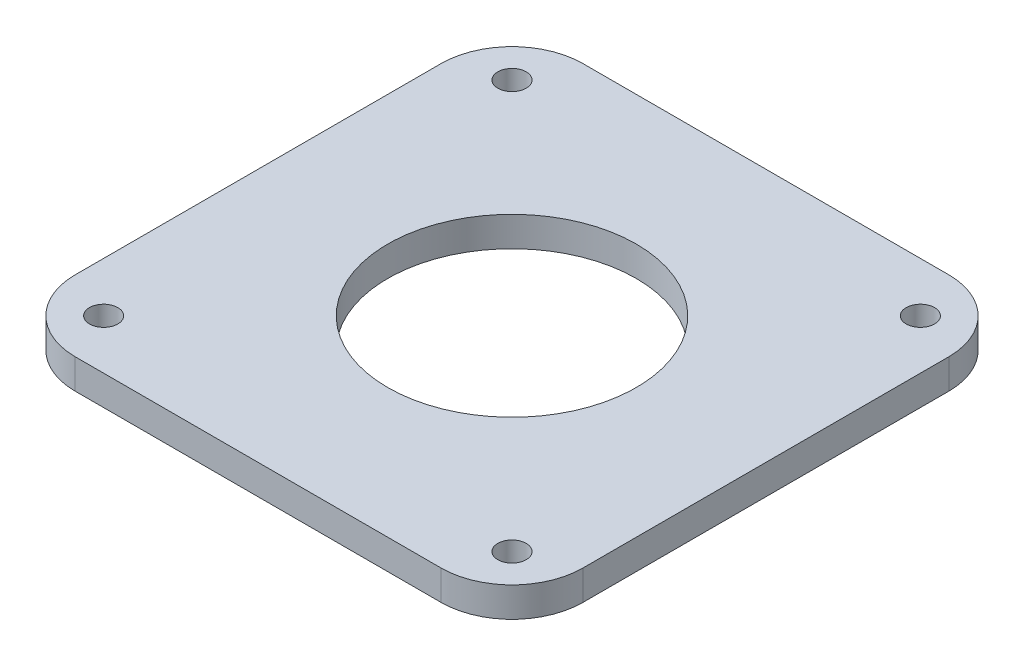
ISO-10303-21;
HEADER;
FILE_DESCRIPTION(('STEP AP214'),'2;1');
FILE_NAME('part.step','',(''),(''),'','','');
FILE_SCHEMA(('AUTOMOTIVE_DESIGN { 1 0 10303 214 1 1 1 1 }'));
ENDSEC;
DATA;
#1=APPLICATION_CONTEXT('core data for automotive mechanical design processes');
#2=APPLICATION_PROTOCOL_DEFINITION('international standard','automotive_design',2000,#1);
#3=PRODUCT_CONTEXT('',#1,'mechanical');
#4=PRODUCT('Part','Part','',(#3));
#5=PRODUCT_RELATED_PRODUCT_CATEGORY('part','',(#4));
#6=PRODUCT_DEFINITION_FORMATION('','',#4);
#7=PRODUCT_DEFINITION_CONTEXT('part definition',#1,'design');
#8=PRODUCT_DEFINITION('design','',#6,#7);
#9=PRODUCT_DEFINITION_SHAPE('','',#8);
#10=(LENGTH_UNIT() NAMED_UNIT(*) SI_UNIT(.MILLI.,.METRE.));
#11=(NAMED_UNIT(*) PLANE_ANGLE_UNIT() SI_UNIT($,.RADIAN.));
#12=(NAMED_UNIT(*) SI_UNIT($,.STERADIAN.) SOLID_ANGLE_UNIT());
#13=UNCERTAINTY_MEASURE_WITH_UNIT(LENGTH_MEASURE(1.E-05),#10,'distance_accuracy_value','');
#14=(GEOMETRIC_REPRESENTATION_CONTEXT(3) GLOBAL_UNCERTAINTY_ASSIGNED_CONTEXT((#13)) GLOBAL_UNIT_ASSIGNED_CONTEXT((#10,
#11,#12)) REPRESENTATION_CONTEXT('',''));
#15=CARTESIAN_POINT('',(0.,0.,0.));
#16=DIRECTION('',(0.,0.,1.));
#17=DIRECTION('',(1.,0.,0.));
#18=AXIS2_PLACEMENT_3D('',#15,#16,#17);
#19=CARTESIAN_POINT('',(35.75,4.2,-35.75));
#20=DIRECTION('',(-1.,0.,0.));
#21=DIRECTION('',(0.,0.,1.));
#22=AXIS2_PLACEMENT_3D('',#19,#20,#21);
#23=PLANE('',#22);
#24=DIRECTION('',(0.,0.,-1.));
#25=VECTOR('',#24,1.);
#26=CARTESIAN_POINT('',(35.75,0.,-35.75));
#27=LINE('',#26,#25);
#28=CARTESIAN_POINT('',(35.75,0.,25.75));
#29=VERTEX_POINT('',#28);
#30=CARTESIAN_POINT('',(35.75,0.,-25.75));
#31=VERTEX_POINT('',#30);
#32=EDGE_CURVE('E141',#29,#31,#27,.T.);
#33=ORIENTED_EDGE('',*,*,#32,.T.);
#34=DIRECTION('',(0.,-1.,0.));
#35=VECTOR('',#34,1.);
#36=CARTESIAN_POINT('',(35.75,4.2,-25.75));
#37=LINE('',#36,#35);
#38=CARTESIAN_POINT('',(35.75,4.2,-25.75));
#39=VERTEX_POINT('',#38);
#40=EDGE_CURVE('E116',#31,#39,#37,.F.);
#41=ORIENTED_EDGE('',*,*,#40,.T.);
#42=DIRECTION('',(0.,0.,-1.));
#43=VECTOR('',#42,1.);
#44=CARTESIAN_POINT('',(35.75,4.2,-35.75));
#45=LINE('',#44,#43);
#46=CARTESIAN_POINT('',(35.75,4.2,25.75));
#47=VERTEX_POINT('',#46);
#48=EDGE_CURVE('E154',#47,#39,#45,.T.);
#49=ORIENTED_EDGE('',*,*,#48,.F.);
#50=DIRECTION('',(0.,-1.,0.));
#51=VECTOR('',#50,1.);
#52=CARTESIAN_POINT('',(35.75,4.2,25.75));
#53=LINE('',#52,#51);
#54=EDGE_CURVE('E122',#47,#29,#53,.T.);
#55=ORIENTED_EDGE('',*,*,#54,.T.);
#56=EDGE_LOOP('',(#33,#41,#49,#55));
#57=FACE_BOUND('',#56,.T.);
#58=ADVANCED_FACE('F44',(#57),#23,.F.);
#59=CARTESIAN_POINT('',(-35.75,4.2,-35.75));
#60=DIRECTION('',(0.,0.,1.));
#61=DIRECTION('',(1.,0.,0.));
#62=AXIS2_PLACEMENT_3D('',#59,#60,#61);
#63=PLANE('',#62);
#64=DIRECTION('',(-1.,0.,0.));
#65=VECTOR('',#64,1.);
#66=CARTESIAN_POINT('',(-35.75,4.2,-35.75));
#67=LINE('',#66,#65);
#68=CARTESIAN_POINT('',(25.75,4.2,-35.75));
#69=VERTEX_POINT('',#68);
#70=CARTESIAN_POINT('',(-25.75,4.2,-35.75));
#71=VERTEX_POINT('',#70);
#72=EDGE_CURVE('E132',#69,#71,#67,.T.);
#73=ORIENTED_EDGE('',*,*,#72,.F.);
#74=DIRECTION('',(0.,-1.,0.));
#75=VECTOR('',#74,1.);
#76=CARTESIAN_POINT('',(25.75,4.2,-35.75));
#77=LINE('',#76,#75);
#78=CARTESIAN_POINT('',(25.75,0.,-35.75));
#79=VERTEX_POINT('',#78);
#80=EDGE_CURVE('E115',#69,#79,#77,.T.);
#81=ORIENTED_EDGE('',*,*,#80,.T.);
#82=DIRECTION('',(-1.,0.,0.));
#83=VECTOR('',#82,1.);
#84=CARTESIAN_POINT('',(-35.75,0.,-35.75));
#85=LINE('',#84,#83);
#86=CARTESIAN_POINT('',(-25.75,0.,-35.75));
#87=VERTEX_POINT('',#86);
#88=EDGE_CURVE('E129',#79,#87,#85,.T.);
#89=ORIENTED_EDGE('',*,*,#88,.T.);
#90=DIRECTION('',(0.,-1.,0.));
#91=VECTOR('',#90,1.);
#92=CARTESIAN_POINT('',(-25.75,4.2,-35.75));
#93=LINE('',#92,#91);
#94=EDGE_CURVE('E135',#87,#71,#93,.F.);
#95=ORIENTED_EDGE('',*,*,#94,.T.);
#96=EDGE_LOOP('',(#73,#81,#89,#95));
#97=FACE_BOUND('',#96,.T.);
#98=ADVANCED_FACE('F128',(#97),#63,.F.);
#99=CARTESIAN_POINT('',(-35.75,4.2,-35.75));
#100=DIRECTION('',(1.,0.,0.));
#101=DIRECTION('',(0.,0.,-1.));
#102=AXIS2_PLACEMENT_3D('',#99,#100,#101);
#103=PLANE('',#102);
#104=DIRECTION('',(0.,0.,1.));
#105=VECTOR('',#104,1.);
#106=CARTESIAN_POINT('',(-35.75,4.2,-35.75));
#107=LINE('',#106,#105);
#108=CARTESIAN_POINT('',(-35.75,4.2,-25.75));
#109=VERTEX_POINT('',#108);
#110=CARTESIAN_POINT('',(-35.75,4.2,25.75));
#111=VERTEX_POINT('',#110);
#112=EDGE_CURVE('E190',#109,#111,#107,.T.);
#113=ORIENTED_EDGE('',*,*,#112,.F.);
#114=DIRECTION('',(0.,-1.,0.));
#115=VECTOR('',#114,1.);
#116=CARTESIAN_POINT('',(-35.75,4.2,-25.75));
#117=LINE('',#116,#115);
#118=CARTESIAN_POINT('',(-35.75,0.,-25.75));
#119=VERTEX_POINT('',#118);
#120=EDGE_CURVE('E184',#109,#119,#117,.T.);
#121=ORIENTED_EDGE('',*,*,#120,.T.);
#122=DIRECTION('',(0.,0.,1.));
#123=VECTOR('',#122,1.);
#124=CARTESIAN_POINT('',(-35.75,0.,-35.75));
#125=LINE('',#124,#123);
#126=CARTESIAN_POINT('',(-35.75,0.,25.75));
#127=VERTEX_POINT('',#126);
#128=EDGE_CURVE('E140',#119,#127,#125,.T.);
#129=ORIENTED_EDGE('',*,*,#128,.T.);
#130=DIRECTION('',(0.,-1.,0.));
#131=VECTOR('',#130,1.);
#132=CARTESIAN_POINT('',(-35.75,4.2,25.75));
#133=LINE('',#132,#131);
#134=EDGE_CURVE('E181',#127,#111,#133,.F.);
#135=ORIENTED_EDGE('',*,*,#134,.T.);
#136=EDGE_LOOP('',(#113,#121,#129,#135));
#137=FACE_BOUND('',#136,.T.);
#138=ADVANCED_FACE('F271',(#137),#103,.F.);
#139=CARTESIAN_POINT('',(-35.75,4.2,35.75));
#140=DIRECTION('',(0.,0.,-1.));
#141=DIRECTION('',(-1.,0.,0.));
#142=AXIS2_PLACEMENT_3D('',#139,#140,#141);
#143=PLANE('',#142);
#144=DIRECTION('',(1.,0.,0.));
#145=VECTOR('',#144,1.);
#146=CARTESIAN_POINT('',(-35.75,4.2,35.75));
#147=LINE('',#146,#145);
#148=CARTESIAN_POINT('',(-25.75,4.2,35.75));
#149=VERTEX_POINT('',#148);
#150=CARTESIAN_POINT('',(25.75,4.2,35.75));
#151=VERTEX_POINT('',#150);
#152=EDGE_CURVE('E156',#149,#151,#147,.T.);
#153=ORIENTED_EDGE('',*,*,#152,.F.);
#154=DIRECTION('',(0.,-1.,0.));
#155=VECTOR('',#154,1.);
#156=CARTESIAN_POINT('',(-25.75,4.2,35.75));
#157=LINE('',#156,#155);
#158=CARTESIAN_POINT('',(-25.75,0.,35.75));
#159=VERTEX_POINT('',#158);
#160=EDGE_CURVE('E11',#149,#159,#157,.T.);
#161=ORIENTED_EDGE('',*,*,#160,.T.);
#162=DIRECTION('',(1.,0.,0.));
#163=VECTOR('',#162,1.);
#164=CARTESIAN_POINT('',(-35.75,0.,35.75));
#165=LINE('',#164,#163);
#166=CARTESIAN_POINT('',(25.75,0.,35.75));
#167=VERTEX_POINT('',#166);
#168=EDGE_CURVE('E146',#159,#167,#165,.T.);
#169=ORIENTED_EDGE('',*,*,#168,.T.);
#170=DIRECTION('',(0.,-1.,0.));
#171=VECTOR('',#170,1.);
#172=CARTESIAN_POINT('',(25.75,4.2,35.75));
#173=LINE('',#172,#171);
#174=EDGE_CURVE('E53',#167,#151,#173,.F.);
#175=ORIENTED_EDGE('',*,*,#174,.T.);
#176=EDGE_LOOP('',(#153,#161,#169,#175));
#177=FACE_BOUND('',#176,.T.);
#178=ADVANCED_FACE('F244',(#177),#143,.F.);
#179=CARTESIAN_POINT('',(0.,4.2,0.));
#180=DIRECTION('',(0.,1.,0.));
#181=DIRECTION('',(0.,0.,1.));
#182=AXIS2_PLACEMENT_3D('',#179,#180,#181);
#183=PLANE('',#182);
#184=CARTESIAN_POINT('',(28.75,4.2,-28.75));
#185=DIRECTION('',(0.,1.,0.));
#186=DIRECTION('',(0.,0.,1.));
#187=AXIS2_PLACEMENT_3D('',#184,#185,#186);
#188=CIRCLE('',#187,2.);
#189=CARTESIAN_POINT('',(28.75,4.2,-26.75));
#190=VERTEX_POINT('',#189);
#191=EDGE_CURVE('E211',#190,#190,#188,.T.);
#192=ORIENTED_EDGE('',*,*,#191,.F.);
#193=EDGE_LOOP('',(#192));
#194=FACE_BOUND('',#193,.T.);
#195=CARTESIAN_POINT('',(-28.75,4.2,28.75));
#196=DIRECTION('',(0.,1.,0.));
#197=DIRECTION('',(0.,0.,1.));
#198=AXIS2_PLACEMENT_3D('',#195,#196,#197);
#199=CIRCLE('',#198,2.);
#200=CARTESIAN_POINT('',(-28.75,4.2,30.75));
#201=VERTEX_POINT('',#200);
#202=EDGE_CURVE('E219',#201,#201,#199,.T.);
#203=ORIENTED_EDGE('',*,*,#202,.F.);
#204=EDGE_LOOP('',(#203));
#205=FACE_BOUND('',#204,.T.);
#206=CARTESIAN_POINT('',(28.75,4.2,28.75));
#207=DIRECTION('',(0.,1.,0.));
#208=DIRECTION('',(0.,0.,1.));
#209=AXIS2_PLACEMENT_3D('',#206,#207,#208);
#210=CIRCLE('',#209,2.);
#211=CARTESIAN_POINT('',(28.75,4.2,30.75));
#212=VERTEX_POINT('',#211);
#213=EDGE_CURVE('E220',#212,#212,#210,.T.);
#214=ORIENTED_EDGE('',*,*,#213,.F.);
#215=EDGE_LOOP('',(#214));
#216=FACE_BOUND('',#215,.T.);
#217=CARTESIAN_POINT('',(-28.75,4.2,-28.75));
#218=DIRECTION('',(0.,1.,0.));
#219=DIRECTION('',(0.,0.,1.));
#220=AXIS2_PLACEMENT_3D('',#217,#218,#219);
#221=CIRCLE('',#220,2.);
#222=CARTESIAN_POINT('',(-28.75,4.2,-26.75));
#223=VERTEX_POINT('',#222);
#224=EDGE_CURVE('E207',#223,#223,#221,.T.);
#225=ORIENTED_EDGE('',*,*,#224,.F.);
#226=EDGE_LOOP('',(#225));
#227=FACE_BOUND('',#226,.T.);
#228=CARTESIAN_POINT('',(0.,4.2,0.));
#229=DIRECTION('',(0.,1.,0.));
#230=DIRECTION('',(0.,0.,1.));
#231=AXIS2_PLACEMENT_3D('',#228,#229,#230);
#232=CIRCLE('',#231,17.5);
#233=CARTESIAN_POINT('',(0.,4.2,17.5));
#234=VERTEX_POINT('',#233);
#235=EDGE_CURVE('E199',#234,#234,#232,.T.);
#236=ORIENTED_EDGE('',*,*,#235,.F.);
#237=EDGE_LOOP('',(#236));
#238=FACE_BOUND('',#237,.T.);
#239=ORIENTED_EDGE('',*,*,#48,.T.);
#240=CARTESIAN_POINT('',(25.75,4.2,-25.75));
#241=DIRECTION('',(0.,1.,0.));
#242=DIRECTION('',(0.,0.,1.));
#243=AXIS2_PLACEMENT_3D('',#240,#241,#242);
#244=CIRCLE('',#243,10.);
#245=EDGE_CURVE('E178',#39,#69,#244,.T.);
#246=ORIENTED_EDGE('',*,*,#245,.T.);
#247=ORIENTED_EDGE('',*,*,#72,.T.);
#248=CARTESIAN_POINT('',(-25.75,4.2,-25.75));
#249=DIRECTION('',(0.,1.,0.));
#250=DIRECTION('',(0.,0.,1.));
#251=AXIS2_PLACEMENT_3D('',#248,#249,#250);
#252=CIRCLE('',#251,10.);
#253=EDGE_CURVE('E175',#71,#109,#252,.T.);
#254=ORIENTED_EDGE('',*,*,#253,.T.);
#255=ORIENTED_EDGE('',*,*,#112,.T.);
#256=CARTESIAN_POINT('',(-25.75,4.2,25.75));
#257=DIRECTION('',(0.,1.,0.));
#258=DIRECTION('',(0.,0.,1.));
#259=AXIS2_PLACEMENT_3D('',#256,#257,#258);
#260=CIRCLE('',#259,10.);
#261=EDGE_CURVE('E66',#111,#149,#260,.T.);
#262=ORIENTED_EDGE('',*,*,#261,.T.);
#263=ORIENTED_EDGE('',*,*,#152,.T.);
#264=CARTESIAN_POINT('',(25.75,4.2,25.75));
#265=DIRECTION('',(0.,1.,0.));
#266=DIRECTION('',(0.,0.,1.));
#267=AXIS2_PLACEMENT_3D('',#264,#265,#266);
#268=CIRCLE('',#267,10.);
#269=EDGE_CURVE('E170',#151,#47,#268,.T.);
#270=ORIENTED_EDGE('',*,*,#269,.T.);
#271=EDGE_LOOP('',(#239,#246,#247,#254,#255,#262,#263,#270));
#272=FACE_BOUND('',#271,.T.);
#273=ADVANCED_FACE('F241',(#194,#205,#216,#227,#238,#272),#183,.T.);
#274=CARTESIAN_POINT('',(0.,0.,0.));
#275=DIRECTION('',(0.,1.,0.));
#276=DIRECTION('',(0.,0.,1.));
#277=AXIS2_PLACEMENT_3D('',#274,#275,#276);
#278=PLANE('',#277);
#279=CARTESIAN_POINT('',(28.75,0.,-28.75));
#280=DIRECTION('',(0.,1.,0.));
#281=DIRECTION('',(0.,0.,1.));
#282=AXIS2_PLACEMENT_3D('',#279,#280,#281);
#283=CIRCLE('',#282,2.);
#284=CARTESIAN_POINT('',(28.75,0.,-26.75));
#285=VERTEX_POINT('',#284);
#286=EDGE_CURVE('E224',#285,#285,#283,.T.);
#287=ORIENTED_EDGE('',*,*,#286,.T.);
#288=EDGE_LOOP('',(#287));
#289=FACE_BOUND('',#288,.T.);
#290=CARTESIAN_POINT('',(-28.75,0.,28.75));
#291=DIRECTION('',(0.,1.,0.));
#292=DIRECTION('',(0.,0.,1.));
#293=AXIS2_PLACEMENT_3D('',#290,#291,#292);
#294=CIRCLE('',#293,2.);
#295=CARTESIAN_POINT('',(-28.75,0.,30.75));
#296=VERTEX_POINT('',#295);
#297=EDGE_CURVE('E215',#296,#296,#294,.T.);
#298=ORIENTED_EDGE('',*,*,#297,.T.);
#299=EDGE_LOOP('',(#298));
#300=FACE_BOUND('',#299,.T.);
#301=CARTESIAN_POINT('',(28.75,0.,28.75));
#302=DIRECTION('',(0.,1.,0.));
#303=DIRECTION('',(0.,0.,1.));
#304=AXIS2_PLACEMENT_3D('',#301,#302,#303);
#305=CIRCLE('',#304,2.);
#306=CARTESIAN_POINT('',(28.75,0.,30.75));
#307=VERTEX_POINT('',#306);
#308=EDGE_CURVE('E231',#307,#307,#305,.T.);
#309=ORIENTED_EDGE('',*,*,#308,.T.);
#310=EDGE_LOOP('',(#309));
#311=FACE_BOUND('',#310,.T.);
#312=CARTESIAN_POINT('',(-28.75,0.,-28.75));
#313=DIRECTION('',(0.,1.,0.));
#314=DIRECTION('',(0.,0.,1.));
#315=AXIS2_PLACEMENT_3D('',#312,#313,#314);
#316=CIRCLE('',#315,2.);
#317=CARTESIAN_POINT('',(-28.75,0.,-26.75));
#318=VERTEX_POINT('',#317);
#319=EDGE_CURVE('E203',#318,#318,#316,.T.);
#320=ORIENTED_EDGE('',*,*,#319,.T.);
#321=EDGE_LOOP('',(#320));
#322=FACE_BOUND('',#321,.T.);
#323=CARTESIAN_POINT('',(0.,0.,0.));
#324=DIRECTION('',(0.,1.,0.));
#325=DIRECTION('',(0.,0.,1.));
#326=AXIS2_PLACEMENT_3D('',#323,#324,#325);
#327=CIRCLE('',#326,17.5);
#328=CARTESIAN_POINT('',(0.,0.,17.5));
#329=VERTEX_POINT('',#328);
#330=EDGE_CURVE('E148',#329,#329,#327,.T.);
#331=ORIENTED_EDGE('',*,*,#330,.T.);
#332=EDGE_LOOP('',(#331));
#333=FACE_BOUND('',#332,.T.);
#334=ORIENTED_EDGE('',*,*,#88,.F.);
#335=CARTESIAN_POINT('',(25.75,0.,-25.75));
#336=DIRECTION('',(0.,1.,0.));
#337=DIRECTION('',(0.,0.,1.));
#338=AXIS2_PLACEMENT_3D('',#335,#336,#337);
#339=CIRCLE('',#338,10.);
#340=EDGE_CURVE('E111',#79,#31,#339,.F.);
#341=ORIENTED_EDGE('',*,*,#340,.T.);
#342=ORIENTED_EDGE('',*,*,#32,.F.);
#343=CARTESIAN_POINT('',(25.75,0.,25.75));
#344=DIRECTION('',(0.,1.,0.));
#345=DIRECTION('',(0.,0.,1.));
#346=AXIS2_PLACEMENT_3D('',#343,#344,#345);
#347=CIRCLE('',#346,10.);
#348=EDGE_CURVE('E134',#29,#167,#347,.F.);
#349=ORIENTED_EDGE('',*,*,#348,.T.);
#350=ORIENTED_EDGE('',*,*,#168,.F.);
#351=CARTESIAN_POINT('',(-25.75,0.,25.75));
#352=DIRECTION('',(0.,1.,0.));
#353=DIRECTION('',(0.,0.,1.));
#354=AXIS2_PLACEMENT_3D('',#351,#352,#353);
#355=CIRCLE('',#354,10.);
#356=EDGE_CURVE('E160',#159,#127,#355,.F.);
#357=ORIENTED_EDGE('',*,*,#356,.T.);
#358=ORIENTED_EDGE('',*,*,#128,.F.);
#359=CARTESIAN_POINT('',(-25.75,0.,-25.75));
#360=DIRECTION('',(0.,1.,0.));
#361=DIRECTION('',(0.,0.,1.));
#362=AXIS2_PLACEMENT_3D('',#359,#360,#361);
#363=CIRCLE('',#362,10.);
#364=EDGE_CURVE('E123',#119,#87,#363,.F.);
#365=ORIENTED_EDGE('',*,*,#364,.T.);
#366=EDGE_LOOP('',(#334,#341,#342,#349,#350,#357,#358,#365));
#367=FACE_BOUND('',#366,.T.);
#368=ADVANCED_FACE('F137',(#289,#300,#311,#322,#333,#367),#278,.F.);
#369=CARTESIAN_POINT('',(25.75,4.2,-25.75));
#370=DIRECTION('',(0.,-1.,0.));
#371=DIRECTION('',(0.,0.,-1.));
#372=AXIS2_PLACEMENT_3D('',#369,#370,#371);
#373=CYLINDRICAL_SURFACE('',#372,10.);
#374=ORIENTED_EDGE('',*,*,#245,.F.);
#375=ORIENTED_EDGE('',*,*,#40,.F.);
#376=ORIENTED_EDGE('',*,*,#340,.F.);
#377=ORIENTED_EDGE('',*,*,#80,.F.);
#378=EDGE_LOOP('',(#374,#375,#376,#377));
#379=FACE_BOUND('',#378,.T.);
#380=ADVANCED_FACE('F114',(#379),#373,.T.);
#381=CARTESIAN_POINT('',(-25.75,4.2,-25.75));
#382=DIRECTION('',(0.,-1.,0.));
#383=DIRECTION('',(0.,0.,-1.));
#384=AXIS2_PLACEMENT_3D('',#381,#382,#383);
#385=CYLINDRICAL_SURFACE('',#384,10.);
#386=ORIENTED_EDGE('',*,*,#253,.F.);
#387=ORIENTED_EDGE('',*,*,#94,.F.);
#388=ORIENTED_EDGE('',*,*,#364,.F.);
#389=ORIENTED_EDGE('',*,*,#120,.F.);
#390=EDGE_LOOP('',(#386,#387,#388,#389));
#391=FACE_BOUND('',#390,.T.);
#392=ADVANCED_FACE('F277',(#391),#385,.T.);
#393=CARTESIAN_POINT('',(-25.75,4.2,25.75));
#394=DIRECTION('',(0.,-1.,0.));
#395=DIRECTION('',(0.,0.,-1.));
#396=AXIS2_PLACEMENT_3D('',#393,#394,#395);
#397=CYLINDRICAL_SURFACE('',#396,10.);
#398=ORIENTED_EDGE('',*,*,#261,.F.);
#399=ORIENTED_EDGE('',*,*,#134,.F.);
#400=ORIENTED_EDGE('',*,*,#356,.F.);
#401=ORIENTED_EDGE('',*,*,#160,.F.);
#402=EDGE_LOOP('',(#398,#399,#400,#401));
#403=FACE_BOUND('',#402,.T.);
#404=ADVANCED_FACE('F262',(#403),#397,.T.);
#405=CARTESIAN_POINT('',(25.75,4.2,25.75));
#406=DIRECTION('',(0.,-1.,0.));
#407=DIRECTION('',(0.,0.,-1.));
#408=AXIS2_PLACEMENT_3D('',#405,#406,#407);
#409=CYLINDRICAL_SURFACE('',#408,10.);
#410=ORIENTED_EDGE('',*,*,#269,.F.);
#411=ORIENTED_EDGE('',*,*,#174,.F.);
#412=ORIENTED_EDGE('',*,*,#348,.F.);
#413=ORIENTED_EDGE('',*,*,#54,.F.);
#414=EDGE_LOOP('',(#410,#411,#412,#413));
#415=FACE_BOUND('',#414,.T.);
#416=ADVANCED_FACE('F46',(#415),#409,.T.);
#417=CARTESIAN_POINT('',(0.,0.,0.));
#418=DIRECTION('',(0.,1.,0.));
#419=DIRECTION('',(0.,0.,1.));
#420=AXIS2_PLACEMENT_3D('',#417,#418,#419);
#421=CYLINDRICAL_SURFACE('',#420,17.5);
#422=ORIENTED_EDGE('',*,*,#330,.F.);
#423=EDGE_LOOP('',(#422));
#424=FACE_BOUND('',#423,.T.);
#425=ORIENTED_EDGE('',*,*,#235,.T.);
#426=EDGE_LOOP('',(#425));
#427=FACE_BOUND('',#426,.T.);
#428=ADVANCED_FACE('F251',(#424,#427),#421,.F.);
#429=CARTESIAN_POINT('',(-28.75,0.,-28.75));
#430=DIRECTION('',(0.,1.,0.));
#431=DIRECTION('',(0.,0.,1.));
#432=AXIS2_PLACEMENT_3D('',#429,#430,#431);
#433=CYLINDRICAL_SURFACE('',#432,2.);
#434=ORIENTED_EDGE('',*,*,#319,.F.);
#435=EDGE_LOOP('',(#434));
#436=FACE_BOUND('',#435,.T.);
#437=ORIENTED_EDGE('',*,*,#224,.T.);
#438=EDGE_LOOP('',(#437));
#439=FACE_BOUND('',#438,.T.);
#440=ADVANCED_FACE('F253',(#436,#439),#433,.F.);
#441=CARTESIAN_POINT('',(28.75,0.,28.75));
#442=DIRECTION('',(0.,1.,0.));
#443=DIRECTION('',(0.,0.,1.));
#444=AXIS2_PLACEMENT_3D('',#441,#442,#443);
#445=CYLINDRICAL_SURFACE('',#444,2.);
#446=ORIENTED_EDGE('',*,*,#308,.F.);
#447=EDGE_LOOP('',(#446));
#448=FACE_BOUND('',#447,.T.);
#449=ORIENTED_EDGE('',*,*,#213,.T.);
#450=EDGE_LOOP('',(#449));
#451=FACE_BOUND('',#450,.T.);
#452=ADVANCED_FACE('F239',(#448,#451),#445,.F.);
#453=CARTESIAN_POINT('',(-28.75,0.,28.75));
#454=DIRECTION('',(0.,1.,0.));
#455=DIRECTION('',(0.,0.,1.));
#456=AXIS2_PLACEMENT_3D('',#453,#454,#455);
#457=CYLINDRICAL_SURFACE('',#456,2.);
#458=ORIENTED_EDGE('',*,*,#297,.F.);
#459=EDGE_LOOP('',(#458));
#460=FACE_BOUND('',#459,.T.);
#461=ORIENTED_EDGE('',*,*,#202,.T.);
#462=EDGE_LOOP('',(#461));
#463=FACE_BOUND('',#462,.T.);
#464=ADVANCED_FACE('F314',(#460,#463),#457,.F.);
#465=CARTESIAN_POINT('',(28.75,0.,-28.75));
#466=DIRECTION('',(0.,1.,0.));
#467=DIRECTION('',(0.,0.,1.));
#468=AXIS2_PLACEMENT_3D('',#465,#466,#467);
#469=CYLINDRICAL_SURFACE('',#468,2.);
#470=ORIENTED_EDGE('',*,*,#286,.F.);
#471=EDGE_LOOP('',(#470));
#472=FACE_BOUND('',#471,.T.);
#473=ORIENTED_EDGE('',*,*,#191,.T.);
#474=EDGE_LOOP('',(#473));
#475=FACE_BOUND('',#474,.T.);
#476=ADVANCED_FACE('F319',(#472,#475),#469,.F.);
#477=CLOSED_SHELL('',(#58,#98,#138,#178,#273,#368,#380,#392,#404,#416,#428,#440,#452,#464,#476));
#478=MANIFOLD_SOLID_BREP('B2',#477);
#479=ADVANCED_BREP_SHAPE_REPRESENTATION('',(#18,#478),#14);
#480=SHAPE_DEFINITION_REPRESENTATION(#9,#479);
ENDSEC;
END-ISO-10303-21;
